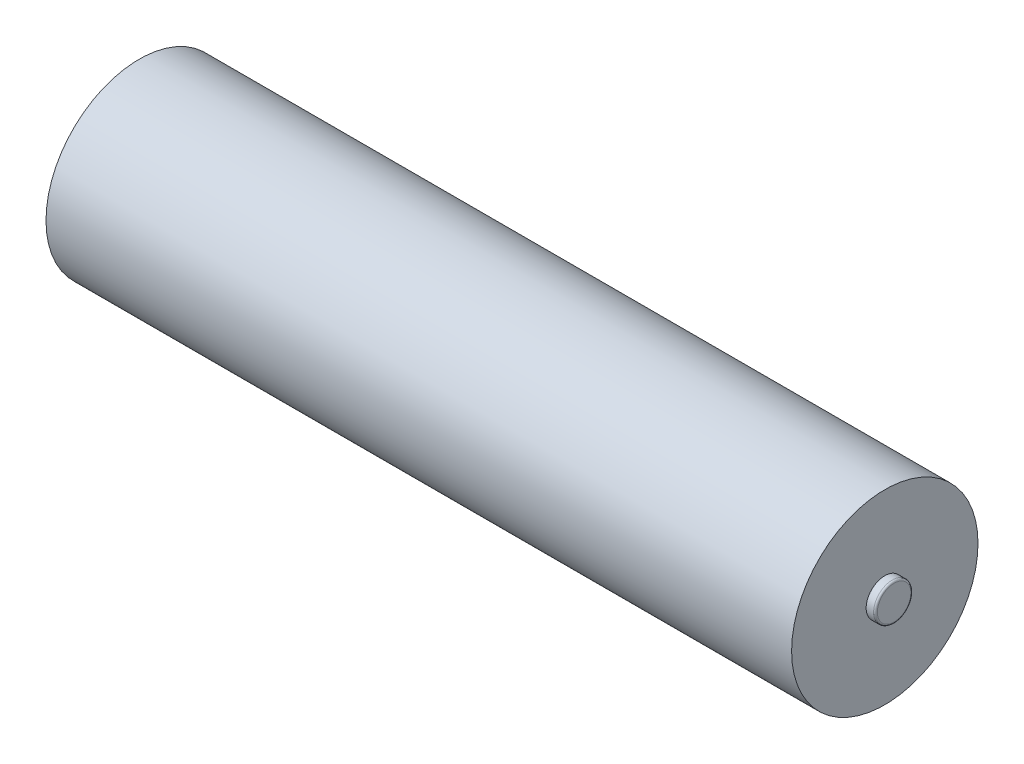
ISO-10303-21;
HEADER;
FILE_DESCRIPTION(('STEP AP214'),'2;1');
FILE_NAME('part.step','',(''),(''),'','','');
FILE_SCHEMA(('AUTOMOTIVE_DESIGN { 1 0 10303 214 1 1 1 1 }'));
ENDSEC;
DATA;
#1=APPLICATION_CONTEXT('core data for automotive mechanical design processes');
#2=APPLICATION_PROTOCOL_DEFINITION('international standard','automotive_design',2000,#1);
#3=PRODUCT_CONTEXT('',#1,'mechanical');
#4=PRODUCT('Part','Part','',(#3));
#5=PRODUCT_RELATED_PRODUCT_CATEGORY('part','',(#4));
#6=PRODUCT_DEFINITION_FORMATION('','',#4);
#7=PRODUCT_DEFINITION_CONTEXT('part definition',#1,'design');
#8=PRODUCT_DEFINITION('design','',#6,#7);
#9=PRODUCT_DEFINITION_SHAPE('','',#8);
#10=(LENGTH_UNIT() NAMED_UNIT(*) SI_UNIT(.MILLI.,.METRE.));
#11=(NAMED_UNIT(*) PLANE_ANGLE_UNIT() SI_UNIT($,.RADIAN.));
#12=(NAMED_UNIT(*) SI_UNIT($,.STERADIAN.) SOLID_ANGLE_UNIT());
#13=UNCERTAINTY_MEASURE_WITH_UNIT(LENGTH_MEASURE(1.E-05),#10,'distance_accuracy_value','');
#14=(GEOMETRIC_REPRESENTATION_CONTEXT(3) GLOBAL_UNCERTAINTY_ASSIGNED_CONTEXT((#13)) GLOBAL_UNIT_ASSIGNED_CONTEXT((#10,
#11,#12)) REPRESENTATION_CONTEXT('',''));
#15=CARTESIAN_POINT('',(0.,0.,0.));
#16=DIRECTION('',(0.,0.,1.));
#17=DIRECTION('',(1.,0.,0.));
#18=AXIS2_PLACEMENT_3D('',#15,#16,#17);
#19=CARTESIAN_POINT('',(200.,0.,0.));
#20=DIRECTION('',(-1.,0.,0.));
#21=DIRECTION('',(0.,0.,1.));
#22=AXIS2_PLACEMENT_3D('',#19,#20,#21);
#23=CYLINDRICAL_SURFACE('',#22,50.);
#24=CARTESIAN_POINT('',(200.,0.,0.));
#25=DIRECTION('',(1.,0.,0.));
#26=DIRECTION('',(0.,0.,-1.));
#27=AXIS2_PLACEMENT_3D('',#24,#25,#26);
#28=CIRCLE('',#27,50.);
#29=CARTESIAN_POINT('',(200.,0.,-50.));
#30=VERTEX_POINT('',#29);
#31=EDGE_CURVE('E66',#30,#30,#28,.T.);
#32=ORIENTED_EDGE('',*,*,#31,.F.);
#33=EDGE_LOOP('',(#32));
#34=FACE_BOUND('',#33,.T.);
#35=CARTESIAN_POINT('',(-200.,0.,0.));
#36=DIRECTION('',(1.,0.,0.));
#37=DIRECTION('',(0.,0.,-1.));
#38=AXIS2_PLACEMENT_3D('',#35,#36,#37);
#39=CIRCLE('',#38,50.);
#40=CARTESIAN_POINT('',(-200.,0.,-50.));
#41=VERTEX_POINT('',#40);
#42=EDGE_CURVE('E62',#41,#41,#39,.T.);
#43=ORIENTED_EDGE('',*,*,#42,.T.);
#44=EDGE_LOOP('',(#43));
#45=FACE_BOUND('',#44,.T.);
#46=ADVANCED_FACE('F37',(#34,#45),#23,.T.);
#47=CARTESIAN_POINT('',(200.,0.,0.));
#48=DIRECTION('',(1.,0.,0.));
#49=DIRECTION('',(0.,0.,-1.));
#50=AXIS2_PLACEMENT_3D('',#47,#48,#49);
#51=PLANE('',#50);
#52=CARTESIAN_POINT('',(200.,0.,0.));
#53=DIRECTION('',(1.,0.,0.));
#54=DIRECTION('',(0.,0.,-1.));
#55=AXIS2_PLACEMENT_3D('',#52,#53,#54);
#56=CIRCLE('',#55,10.);
#57=CARTESIAN_POINT('',(200.,0.,-10.));
#58=VERTEX_POINT('',#57);
#59=EDGE_CURVE('E61',#58,#58,#56,.T.);
#60=ORIENTED_EDGE('',*,*,#59,.F.);
#61=EDGE_LOOP('',(#60));
#62=FACE_BOUND('',#61,.T.);
#63=ORIENTED_EDGE('',*,*,#31,.T.);
#64=EDGE_LOOP('',(#63));
#65=FACE_BOUND('',#64,.T.);
#66=ADVANCED_FACE('F95',(#62,#65),#51,.T.);
#67=CARTESIAN_POINT('',(-200.,0.,0.));
#68=DIRECTION('',(1.,0.,0.));
#69=DIRECTION('',(0.,0.,-1.));
#70=AXIS2_PLACEMENT_3D('',#67,#68,#69);
#71=PLANE('',#70);
#72=CARTESIAN_POINT('',(-200.,0.,0.));
#73=DIRECTION('',(1.,0.,0.));
#74=DIRECTION('',(0.,0.,-1.));
#75=AXIS2_PLACEMENT_3D('',#72,#73,#74);
#76=CIRCLE('',#75,10.);
#77=CARTESIAN_POINT('',(-200.,0.,-10.));
#78=VERTEX_POINT('',#77);
#79=EDGE_CURVE('E67',#78,#78,#76,.T.);
#80=ORIENTED_EDGE('',*,*,#79,.T.);
#81=EDGE_LOOP('',(#80));
#82=FACE_BOUND('',#81,.T.);
#83=ORIENTED_EDGE('',*,*,#42,.F.);
#84=EDGE_LOOP('',(#83));
#85=FACE_BOUND('',#84,.T.);
#86=ADVANCED_FACE('F78',(#82,#85),#71,.F.);
#87=CARTESIAN_POINT('',(205.,0.,0.));
#88=DIRECTION('',(-1.,0.,0.));
#89=DIRECTION('',(0.,0.,1.));
#90=AXIS2_PLACEMENT_3D('',#87,#88,#89);
#91=CYLINDRICAL_SURFACE('',#90,10.);
#92=CARTESIAN_POINT('',(204.,0.,0.));
#93=DIRECTION('',(1.,0.,0.));
#94=DIRECTION('',(0.,0.,-1.));
#95=AXIS2_PLACEMENT_3D('',#92,#93,#94);
#96=CIRCLE('',#95,10.);
#97=CARTESIAN_POINT('',(204.,0.,-10.));
#98=VERTEX_POINT('',#97);
#99=EDGE_CURVE('E50',#98,#98,#96,.F.);
#100=ORIENTED_EDGE('',*,*,#99,.T.);
#101=EDGE_LOOP('',(#100));
#102=FACE_BOUND('',#101,.T.);
#103=ORIENTED_EDGE('',*,*,#59,.T.);
#104=EDGE_LOOP('',(#103));
#105=FACE_BOUND('',#104,.T.);
#106=ADVANCED_FACE('F107',(#102,#105),#91,.T.);
#107=CARTESIAN_POINT('',(205.,0.,0.));
#108=DIRECTION('',(1.,0.,0.));
#109=DIRECTION('',(0.,0.,-1.));
#110=AXIS2_PLACEMENT_3D('',#107,#108,#109);
#111=PLANE('',#110);
#112=CARTESIAN_POINT('',(205.,0.,0.));
#113=DIRECTION('',(1.,0.,0.));
#114=DIRECTION('',(0.,0.,-1.));
#115=AXIS2_PLACEMENT_3D('',#112,#113,#114);
#116=CIRCLE('',#115,9.);
#117=CARTESIAN_POINT('',(205.,0.,-9.));
#118=VERTEX_POINT('',#117);
#119=EDGE_CURVE('E55',#118,#118,#116,.T.);
#120=ORIENTED_EDGE('',*,*,#119,.T.);
#121=EDGE_LOOP('',(#120));
#122=FACE_BOUND('',#121,.T.);
#123=ADVANCED_FACE('F91',(#122),#111,.T.);
#124=CARTESIAN_POINT('',(204.,0.,0.));
#125=DIRECTION('',(1.,0.,0.));
#126=DIRECTION('',(0.,0.,-1.));
#127=AXIS2_PLACEMENT_3D('',#124,#125,#126);
#128=TOROIDAL_SURFACE('',#127,9.,1.);
#129=ORIENTED_EDGE('',*,*,#99,.F.);
#130=EDGE_LOOP('',(#129));
#131=FACE_BOUND('',#130,.T.);
#132=ORIENTED_EDGE('',*,*,#119,.F.);
#133=EDGE_LOOP('',(#132));
#134=FACE_BOUND('',#133,.T.);
#135=ADVANCED_FACE('F84',(#131,#134),#128,.T.);
#136=CARTESIAN_POINT('',(-205.,0.,0.));
#137=DIRECTION('',(1.,0.,0.));
#138=DIRECTION('',(0.,0.,-1.));
#139=AXIS2_PLACEMENT_3D('',#136,#137,#138);
#140=CYLINDRICAL_SURFACE('',#139,10.);
#141=CARTESIAN_POINT('',(-204.,0.,0.));
#142=DIRECTION('',(-1.,0.,0.));
#143=DIRECTION('',(0.,0.,1.));
#144=AXIS2_PLACEMENT_3D('',#141,#142,#143);
#145=CIRCLE('',#144,10.);
#146=CARTESIAN_POINT('',(-204.,0.,10.));
#147=VERTEX_POINT('',#146);
#148=EDGE_CURVE('E45',#147,#147,#145,.F.);
#149=ORIENTED_EDGE('',*,*,#148,.T.);
#150=EDGE_LOOP('',(#149));
#151=FACE_BOUND('',#150,.T.);
#152=ORIENTED_EDGE('',*,*,#79,.F.);
#153=EDGE_LOOP('',(#152));
#154=FACE_BOUND('',#153,.T.);
#155=ADVANCED_FACE('F81',(#151,#154),#140,.T.);
#156=CARTESIAN_POINT('',(-205.,0.,0.));
#157=DIRECTION('',(-1.,0.,0.));
#158=DIRECTION('',(0.,0.,-1.));
#159=AXIS2_PLACEMENT_3D('',#156,#157,#158);
#160=PLANE('',#159);
#161=CARTESIAN_POINT('',(-205.,0.,0.));
#162=DIRECTION('',(-1.,0.,0.));
#163=DIRECTION('',(0.,0.,1.));
#164=AXIS2_PLACEMENT_3D('',#161,#162,#163);
#165=CIRCLE('',#164,9.);
#166=CARTESIAN_POINT('',(-205.,0.,9.));
#167=VERTEX_POINT('',#166);
#168=EDGE_CURVE('E10',#167,#167,#165,.T.);
#169=ORIENTED_EDGE('',*,*,#168,.T.);
#170=EDGE_LOOP('',(#169));
#171=FACE_BOUND('',#170,.T.);
#172=ADVANCED_FACE('F83',(#171),#160,.T.);
#173=CARTESIAN_POINT('',(-204.,0.,0.));
#174=DIRECTION('',(-1.,0.,0.));
#175=DIRECTION('',(0.,0.,1.));
#176=AXIS2_PLACEMENT_3D('',#173,#174,#175);
#177=TOROIDAL_SURFACE('',#176,9.,1.);
#178=ORIENTED_EDGE('',*,*,#168,.F.);
#179=EDGE_LOOP('',(#178));
#180=FACE_BOUND('',#179,.T.);
#181=ORIENTED_EDGE('',*,*,#148,.F.);
#182=EDGE_LOOP('',(#181));
#183=FACE_BOUND('',#182,.T.);
#184=ADVANCED_FACE('F39',(#180,#183),#177,.T.);
#185=CLOSED_SHELL('',(#46,#66,#86,#106,#123,#135,#155,#172,#184));
#186=MANIFOLD_SOLID_BREP('B2',#185);
#187=ADVANCED_BREP_SHAPE_REPRESENTATION('',(#18,#186),#14);
#188=SHAPE_DEFINITION_REPRESENTATION(#9,#187);
ENDSEC;
END-ISO-10303-21;
